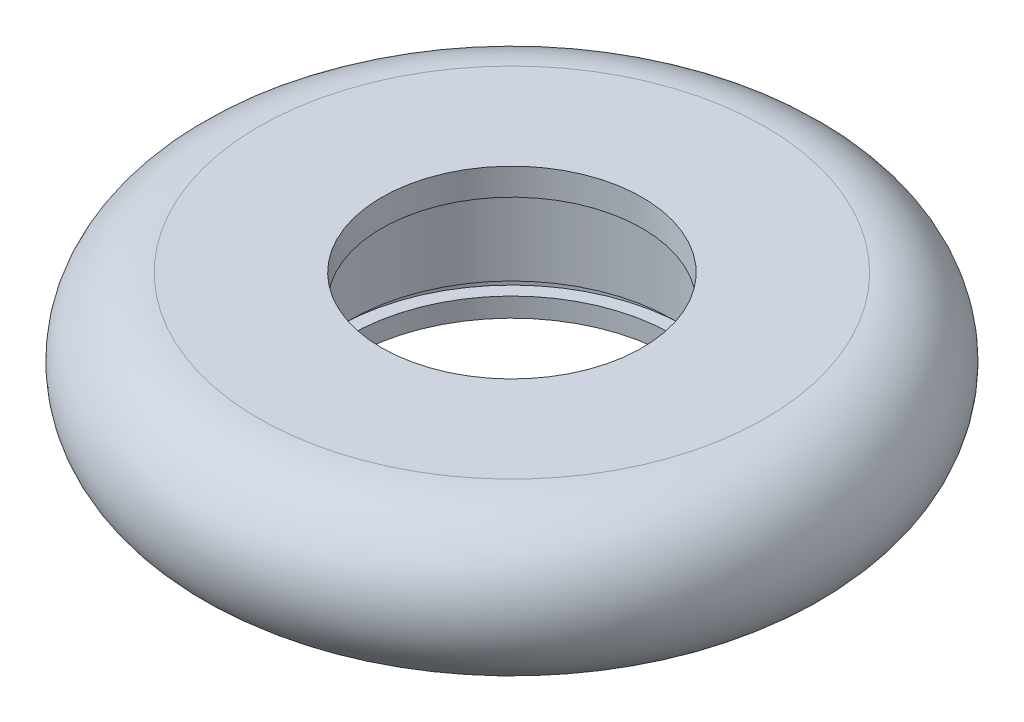
ISO-10303-21;
HEADER;
FILE_DESCRIPTION(('STEP AP214'),'2;1');
FILE_NAME('part.step','',(''),(''),'','','');
FILE_SCHEMA(('AUTOMOTIVE_DESIGN { 1 0 10303 214 1 1 1 1 }'));
ENDSEC;
DATA;
#1=APPLICATION_CONTEXT('core data for automotive mechanical design processes');
#2=APPLICATION_PROTOCOL_DEFINITION('international standard','automotive_design',2000,#1);
#3=PRODUCT_CONTEXT('',#1,'mechanical');
#4=PRODUCT('Part','Part','',(#3));
#5=PRODUCT_RELATED_PRODUCT_CATEGORY('part','',(#4));
#6=PRODUCT_DEFINITION_FORMATION('','',#4);
#7=PRODUCT_DEFINITION_CONTEXT('part definition',#1,'design');
#8=PRODUCT_DEFINITION('design','',#6,#7);
#9=PRODUCT_DEFINITION_SHAPE('','',#8);
#10=(LENGTH_UNIT() NAMED_UNIT(*) SI_UNIT(.MILLI.,.METRE.));
#11=(NAMED_UNIT(*) PLANE_ANGLE_UNIT() SI_UNIT($,.RADIAN.));
#12=(NAMED_UNIT(*) SI_UNIT($,.STERADIAN.) SOLID_ANGLE_UNIT());
#13=UNCERTAINTY_MEASURE_WITH_UNIT(LENGTH_MEASURE(1.E-05),#10,'distance_accuracy_value','');
#14=(GEOMETRIC_REPRESENTATION_CONTEXT(3) GLOBAL_UNCERTAINTY_ASSIGNED_CONTEXT((#13)) GLOBAL_UNIT_ASSIGNED_CONTEXT((#10,
#11,#12)) REPRESENTATION_CONTEXT('',''));
#15=CARTESIAN_POINT('',(0.,0.,0.));
#16=DIRECTION('',(0.,0.,1.));
#17=DIRECTION('',(1.,0.,0.));
#18=AXIS2_PLACEMENT_3D('',#15,#16,#17);
#19=CARTESIAN_POINT('',(0.,16.5,0.));
#20=DIRECTION('',(0.,-1.,0.));
#21=DIRECTION('',(0.,0.,-1.));
#22=AXIS2_PLACEMENT_3D('',#19,#20,#21);
#23=CYLINDRICAL_SURFACE('',#22,21.);
#24=CARTESIAN_POINT('',(0.,2.5,0.));
#25=DIRECTION('',(0.,-1.,0.));
#26=DIRECTION('',(0.,0.,-1.));
#27=AXIS2_PLACEMENT_3D('',#24,#25,#26);
#28=CIRCLE('',#27,21.);
#29=CARTESIAN_POINT('',(0.,2.5,-21.));
#30=VERTEX_POINT('',#29);
#31=EDGE_CURVE('E56',#30,#30,#28,.T.);
#32=ORIENTED_EDGE('',*,*,#31,.F.);
#33=EDGE_LOOP('',(#32));
#34=FACE_BOUND('',#33,.T.);
#35=CARTESIAN_POINT('',(0.,0.,0.));
#36=DIRECTION('',(0.,-1.,0.));
#37=DIRECTION('',(0.,0.,-1.));
#38=AXIS2_PLACEMENT_3D('',#35,#36,#37);
#39=CIRCLE('',#38,21.);
#40=CARTESIAN_POINT('',(0.,0.,-21.));
#41=VERTEX_POINT('',#40);
#42=EDGE_CURVE('E48',#41,#41,#39,.T.);
#43=ORIENTED_EDGE('',*,*,#42,.T.);
#44=EDGE_LOOP('',(#43));
#45=FACE_BOUND('',#44,.T.);
#46=ADVANCED_FACE('F33',(#34,#45),#23,.F.);
#47=CARTESIAN_POINT('',(10.,0.,0.));
#48=DIRECTION('',(0.,-1.,0.));
#49=DIRECTION('',(0.,0.,-1.));
#50=AXIS2_PLACEMENT_3D('',#47,#48,#49);
#51=PLANE('',#50);
#52=ORIENTED_EDGE('',*,*,#42,.F.);
#53=EDGE_LOOP('',(#52));
#54=FACE_BOUND('',#53,.T.);
#55=CARTESIAN_POINT('',(0.,0.,0.));
#56=DIRECTION('',(0.,-1.,0.));
#57=DIRECTION('',(0.,0.,-1.));
#58=AXIS2_PLACEMENT_3D('',#55,#56,#57);
#59=CIRCLE('',#58,33.);
#60=CARTESIAN_POINT('',(0.,0.,-33.));
#61=VERTEX_POINT('',#60);
#62=EDGE_CURVE('E10',#61,#61,#59,.T.);
#63=ORIENTED_EDGE('',*,*,#62,.T.);
#64=EDGE_LOOP('',(#63));
#65=FACE_BOUND('',#64,.T.);
#66=ADVANCED_FACE('F35',(#54,#65),#51,.T.);
#67=CARTESIAN_POINT('',(0.,10.,0.));
#68=DIRECTION('',(0.,-1.,0.));
#69=DIRECTION('',(0.,0.,-1.));
#70=AXIS2_PLACEMENT_3D('',#67,#68,#69);
#71=TOROIDAL_SURFACE('',#70,33.,10.);
#72=CARTESIAN_POINT('',(0.,20.,0.));
#73=DIRECTION('',(0.,-1.,0.));
#74=DIRECTION('',(0.,0.,-1.));
#75=AXIS2_PLACEMENT_3D('',#72,#73,#74);
#76=CIRCLE('',#75,33.);
#77=CARTESIAN_POINT('',(0.,20.,-33.));
#78=VERTEX_POINT('',#77);
#79=EDGE_CURVE('E41',#78,#78,#76,.T.);
#80=ORIENTED_EDGE('',*,*,#79,.T.);
#81=EDGE_LOOP('',(#80));
#82=FACE_BOUND('',#81,.T.);
#83=ORIENTED_EDGE('',*,*,#62,.F.);
#84=EDGE_LOOP('',(#83));
#85=FACE_BOUND('',#84,.T.);
#86=ADVANCED_FACE('F89',(#82,#85),#71,.T.);
#87=CARTESIAN_POINT('',(33.,20.,0.));
#88=DIRECTION('',(0.,1.,0.));
#89=DIRECTION('',(0.,0.,1.));
#90=AXIS2_PLACEMENT_3D('',#87,#88,#89);
#91=PLANE('',#90);
#92=CARTESIAN_POINT('',(0.,20.,0.));
#93=DIRECTION('',(0.,1.,0.));
#94=DIRECTION('',(0.,0.,1.));
#95=AXIS2_PLACEMENT_3D('',#92,#93,#94);
#96=CIRCLE('',#95,17.);
#97=CARTESIAN_POINT('',(0.,20.,17.));
#98=VERTEX_POINT('',#97);
#99=EDGE_CURVE('E65',#98,#98,#96,.T.);
#100=ORIENTED_EDGE('',*,*,#99,.F.);
#101=EDGE_LOOP('',(#100));
#102=FACE_BOUND('',#101,.T.);
#103=ORIENTED_EDGE('',*,*,#79,.F.);
#104=EDGE_LOOP('',(#103));
#105=FACE_BOUND('',#104,.T.);
#106=ADVANCED_FACE('F83',(#102,#105),#91,.T.);
#107=CARTESIAN_POINT('',(0.,4.2,0.));
#108=DIRECTION('',(0.,-1.,0.));
#109=DIRECTION('',(0.,0.,-1.));
#110=AXIS2_PLACEMENT_3D('',#107,#108,#109);
#111=CIRCLE('',#110,21.);
#112=CARTESIAN_POINT('',(0.,4.2,-21.));
#113=VERTEX_POINT('',#112);
#114=EDGE_CURVE('E59',#113,#113,#111,.T.);
#115=ORIENTED_EDGE('',*,*,#114,.T.);
#116=EDGE_LOOP('',(#115));
#117=FACE_BOUND('',#116,.T.);
#118=CARTESIAN_POINT('',(0.,16.5,0.));
#119=DIRECTION('',(0.,-1.,0.));
#120=DIRECTION('',(0.,0.,-1.));
#121=AXIS2_PLACEMENT_3D('',#118,#119,#120);
#122=CIRCLE('',#121,21.);
#123=CARTESIAN_POINT('',(0.,16.5,-21.));
#124=VERTEX_POINT('',#123);
#125=EDGE_CURVE('E45',#124,#124,#122,.T.);
#126=ORIENTED_EDGE('',*,*,#125,.F.);
#127=EDGE_LOOP('',(#126));
#128=FACE_BOUND('',#127,.T.);
#129=ADVANCED_FACE('F78',(#117,#128),#23,.F.);
#130=CARTESIAN_POINT('',(0.,16.5,0.));
#131=DIRECTION('',(0.,-1.,0.));
#132=DIRECTION('',(0.,0.,-1.));
#133=AXIS2_PLACEMENT_3D('',#130,#131,#132);
#134=PLANE('',#133);
#135=CARTESIAN_POINT('',(0.,16.5,0.));
#136=DIRECTION('',(0.,-1.,0.));
#137=DIRECTION('',(0.,0.,-1.));
#138=AXIS2_PLACEMENT_3D('',#135,#136,#137);
#139=CIRCLE('',#138,17.);
#140=CARTESIAN_POINT('',(0.,16.5,-17.));
#141=VERTEX_POINT('',#140);
#142=EDGE_CURVE('E37',#141,#141,#139,.T.);
#143=ORIENTED_EDGE('',*,*,#142,.F.);
#144=EDGE_LOOP('',(#143));
#145=FACE_BOUND('',#144,.T.);
#146=ORIENTED_EDGE('',*,*,#125,.T.);
#147=EDGE_LOOP('',(#146));
#148=FACE_BOUND('',#147,.T.);
#149=ADVANCED_FACE('F74',(#145,#148),#134,.T.);
#150=CARTESIAN_POINT('',(0.,0.,0.));
#151=DIRECTION('',(0.,-1.,0.));
#152=DIRECTION('',(0.,0.,-1.));
#153=AXIS2_PLACEMENT_3D('',#150,#151,#152);
#154=CYLINDRICAL_SURFACE('',#153,22.75);
#155=CARTESIAN_POINT('',(0.,4.2,0.));
#156=DIRECTION('',(0.,-1.,0.));
#157=DIRECTION('',(0.,0.,-1.));
#158=AXIS2_PLACEMENT_3D('',#155,#156,#157);
#159=CIRCLE('',#158,22.75);
#160=CARTESIAN_POINT('',(0.,4.2,-22.75));
#161=VERTEX_POINT('',#160);
#162=EDGE_CURVE('E62',#161,#161,#159,.T.);
#163=ORIENTED_EDGE('',*,*,#162,.F.);
#164=EDGE_LOOP('',(#163));
#165=FACE_BOUND('',#164,.T.);
#166=CARTESIAN_POINT('',(0.,2.5,0.));
#167=DIRECTION('',(0.,-1.,0.));
#168=DIRECTION('',(0.,0.,-1.));
#169=AXIS2_PLACEMENT_3D('',#166,#167,#168);
#170=CIRCLE('',#169,22.75);
#171=CARTESIAN_POINT('',(0.,2.5,-22.75));
#172=VERTEX_POINT('',#171);
#173=EDGE_CURVE('E51',#172,#172,#170,.T.);
#174=ORIENTED_EDGE('',*,*,#173,.T.);
#175=EDGE_LOOP('',(#174));
#176=FACE_BOUND('',#175,.T.);
#177=ADVANCED_FACE('F77',(#165,#176),#154,.F.);
#178=CARTESIAN_POINT('',(0.,2.5,-22.75));
#179=DIRECTION('',(0.,-1.,0.));
#180=DIRECTION('',(0.,0.,-1.));
#181=AXIS2_PLACEMENT_3D('',#178,#179,#180);
#182=PLANE('',#181);
#183=ORIENTED_EDGE('',*,*,#173,.F.);
#184=EDGE_LOOP('',(#183));
#185=FACE_BOUND('',#184,.T.);
#186=ORIENTED_EDGE('',*,*,#31,.T.);
#187=EDGE_LOOP('',(#186));
#188=FACE_BOUND('',#187,.T.);
#189=ADVANCED_FACE('F102',(#185,#188),#182,.F.);
#190=CARTESIAN_POINT('',(0.,4.2,-22.75));
#191=DIRECTION('',(0.,1.,0.));
#192=DIRECTION('',(0.,0.,1.));
#193=AXIS2_PLACEMENT_3D('',#190,#191,#192);
#194=PLANE('',#193);
#195=ORIENTED_EDGE('',*,*,#114,.F.);
#196=EDGE_LOOP('',(#195));
#197=FACE_BOUND('',#196,.T.);
#198=ORIENTED_EDGE('',*,*,#162,.T.);
#199=EDGE_LOOP('',(#198));
#200=FACE_BOUND('',#199,.T.);
#201=ADVANCED_FACE('F104',(#197,#200),#194,.F.);
#202=CARTESIAN_POINT('',(0.,4.,0.));
#203=DIRECTION('',(0.,1.,0.));
#204=DIRECTION('',(0.,0.,1.));
#205=AXIS2_PLACEMENT_3D('',#202,#203,#204);
#206=CYLINDRICAL_SURFACE('',#205,17.);
#207=ORIENTED_EDGE('',*,*,#142,.T.);
#208=EDGE_LOOP('',(#207));
#209=FACE_BOUND('',#208,.T.);
#210=ORIENTED_EDGE('',*,*,#99,.T.);
#211=EDGE_LOOP('',(#210));
#212=FACE_BOUND('',#211,.T.);
#213=ADVANCED_FACE('F72',(#209,#212),#206,.F.);
#214=CLOSED_SHELL('',(#46,#66,#86,#106,#129,#149,#177,#189,#201,#213));
#215=MANIFOLD_SOLID_BREP('B2',#214);
#216=ADVANCED_BREP_SHAPE_REPRESENTATION('',(#18,#215),#14);
#217=SHAPE_DEFINITION_REPRESENTATION(#9,#216);
ENDSEC;
END-ISO-10303-21;
